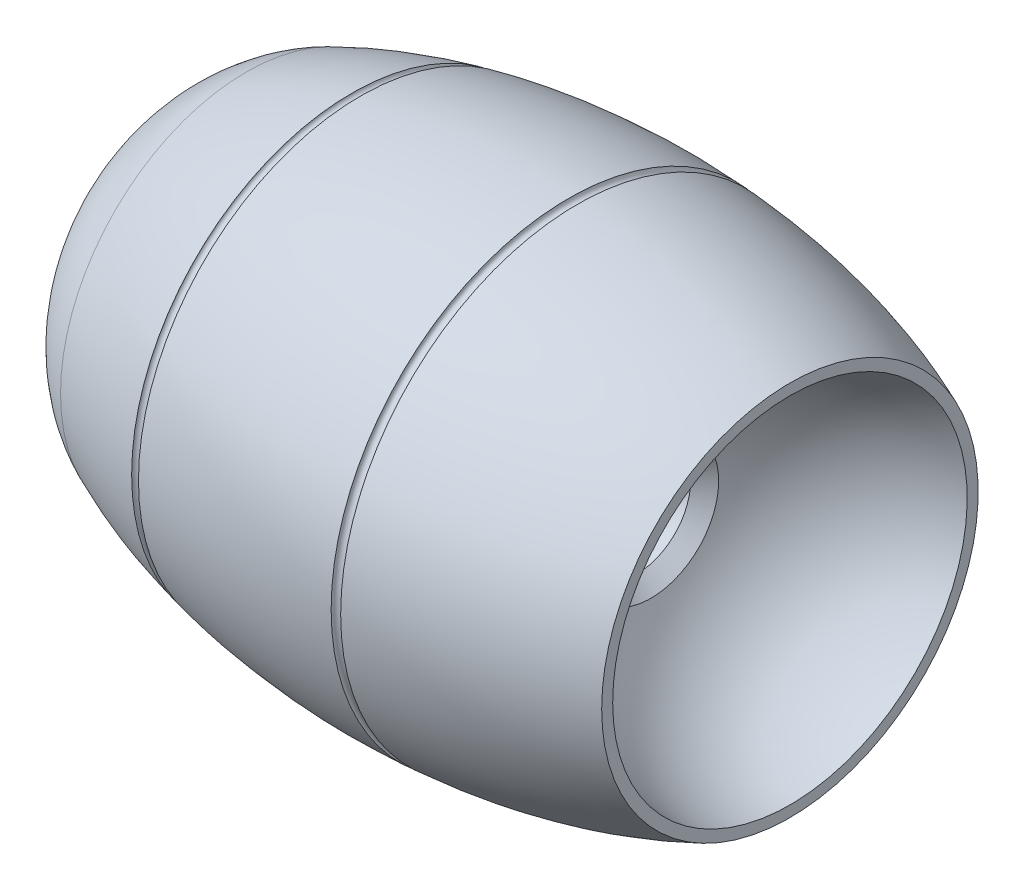
ISO-10303-21;
HEADER;
FILE_DESCRIPTION(('STEP AP214'),'2;1');
FILE_NAME('part.step','',(''),(''),'','','');
FILE_SCHEMA(('AUTOMOTIVE_DESIGN { 1 0 10303 214 1 1 1 1 }'));
ENDSEC;
DATA;
#1=APPLICATION_CONTEXT('core data for automotive mechanical design processes');
#2=APPLICATION_PROTOCOL_DEFINITION('international standard','automotive_design',2000,#1);
#3=PRODUCT_CONTEXT('',#1,'mechanical');
#4=PRODUCT('Part','Part','',(#3));
#5=PRODUCT_RELATED_PRODUCT_CATEGORY('part','',(#4));
#6=PRODUCT_DEFINITION_FORMATION('','',#4);
#7=PRODUCT_DEFINITION_CONTEXT('part definition',#1,'design');
#8=PRODUCT_DEFINITION('design','',#6,#7);
#9=PRODUCT_DEFINITION_SHAPE('','',#8);
#10=(LENGTH_UNIT() NAMED_UNIT(*) SI_UNIT(.MILLI.,.METRE.));
#11=(NAMED_UNIT(*) PLANE_ANGLE_UNIT() SI_UNIT($,.RADIAN.));
#12=(NAMED_UNIT(*) SI_UNIT($,.STERADIAN.) SOLID_ANGLE_UNIT());
#13=UNCERTAINTY_MEASURE_WITH_UNIT(LENGTH_MEASURE(1.E-05),#10,'distance_accuracy_value','');
#14=(GEOMETRIC_REPRESENTATION_CONTEXT(3) GLOBAL_UNCERTAINTY_ASSIGNED_CONTEXT((#13)) GLOBAL_UNIT_ASSIGNED_CONTEXT((#10,
#11,#12)) REPRESENTATION_CONTEXT('',''));
#15=CARTESIAN_POINT('',(0.,0.,0.));
#16=DIRECTION('',(0.,0.,1.));
#17=DIRECTION('',(1.,0.,0.));
#18=AXIS2_PLACEMENT_3D('',#15,#16,#17);
#19=CARTESIAN_POINT('',(0.,0.,0.));
#20=DIRECTION('',(0.,0.,1.));
#21=DIRECTION('',(-1.,0.,0.));
#22=AXIS2_PLACEMENT_3D('',#19,#20,#21);
#23=ELLIPSE('',#22,24.3923534354673,13.3152623381413);
#24=TRIMMED_CURVE('',#23,(PARAMETER_VALUE(3.14159265358979)),
(PARAMETER_VALUE(6.28318530717959)),.T.,.PARAMETER.);
#25=CARTESIAN_POINT('',(-11.7700081508722,0.,0.));
#26=DIRECTION('',(-1.,0.,0.));
#27=AXIS1_PLACEMENT('',#25,#26);
#28=SURFACE_OF_REVOLUTION('',#24,#27);
#29=CARTESIAN_POINT('',(15.,0.,0.));
#30=DIRECTION('',(-1.,0.,0.));
#31=DIRECTION('',(0.,0.,1.));
#32=AXIS2_PLACEMENT_3D('',#29,#30,#31);
#33=CIRCLE('',#32,10.499997616947);
#34=CARTESIAN_POINT('',(15.,0.,10.499997616947));
#35=VERTEX_POINT('',#34);
#36=EDGE_CURVE('E63',#35,#35,#33,.T.);
#37=ORIENTED_EDGE('',*,*,#36,.T.);
#38=EDGE_LOOP('',(#37));
#39=FACE_BOUND('',#38,.T.);
#40=CARTESIAN_POINT('',(3.14550472570225,0.,0.));
#41=DIRECTION('',(-1.,0.,0.));
#42=DIRECTION('',(0.,0.,1.));
#43=AXIS2_PLACEMENT_3D('',#40,#41,#42);
#44=CIRCLE('',#43,13.2040866382898);
#45=CARTESIAN_POINT('',(3.14550472570225,0.,13.2040866382898));
#46=VERTEX_POINT('',#45);
#47=EDGE_CURVE('E48',#46,#46,#44,.T.);
#48=ORIENTED_EDGE('',*,*,#47,.F.);
#49=EDGE_LOOP('',(#48));
#50=FACE_BOUND('',#49,.T.);
#51=ADVANCED_FACE('F43',(#39,#50),#28,.T.);
#52=CARTESIAN_POINT('',(15.0070741860432,0.,0.));
#53=DIRECTION('',(-1.,0.,0.));
#54=DIRECTION('',(0.,0.,1.));
#55=AXIS2_PLACEMENT_3D('',#52,#53,#54);
#56=CONICAL_SURFACE('',#55,0.,1.57012259473982);
#57=ORIENTED_EDGE('',*,*,#36,.F.);
#58=EDGE_LOOP('',(#57));
#59=FACE_BOUND('',#58,.T.);
#60=CARTESIAN_POINT('',(15.0004130483374,0.,0.));
#61=DIRECTION('',(1.,0.,0.));
#62=DIRECTION('',(0.,0.,-1.));
#63=AXIS2_PLACEMENT_3D('',#60,#61,#62);
#64=CIRCLE('',#63,9.88692262407283);
#65=CARTESIAN_POINT('',(15.0004130483374,9.88692262407283,0.));
#66=VERTEX_POINT('',#65);
#67=EDGE_CURVE('E67',#66,#66,#64,.T.);
#68=ORIENTED_EDGE('',*,*,#67,.F.);
#69=EDGE_LOOP('',(#68));
#70=FACE_BOUND('',#69,.T.);
#71=ADVANCED_FACE('F97',(#59,#70),#56,.T.);
#72=CARTESIAN_POINT('',(16.5,0.,0.));
#73=DIRECTION('',(-1.,0.,0.));
#74=DIRECTION('',(0.,1.,0.));
#75=AXIS2_PLACEMENT_3D('',#72,#73,#74);
#76=SPHERICAL_SURFACE('',#75,10.);
#77=CARTESIAN_POINT('',(7.2428665095737,0.,0.));
#78=DIRECTION('',(1.,0.,0.));
#79=DIRECTION('',(0.,0.,-1.));
#80=AXIS2_PLACEMENT_3D('',#77,#78,#79);
#81=CIRCLE('',#80,3.78225852374316);
#82=CARTESIAN_POINT('',(7.2428665095737,3.78225852374316,0.));
#83=VERTEX_POINT('',#82);
#84=EDGE_CURVE('E55',#83,#83,#81,.F.);
#85=CARTESIAN_POINT('',(7.2428665095737,3.78225852374316,0.));
#86=CARTESIAN_POINT('',(7.28354059362433,3.88181065752473,0.));
#87=CARTESIAN_POINT('',(7.32582172420384,3.98070614875977,0.));
#88=CARTESIAN_POINT('',(7.41355147396425,4.17708208116004,0.));
#89=CARTESIAN_POINT('',(7.45900009314515,4.27456252232527,0.));
#90=CARTESIAN_POINT('',(7.55301821565196,4.46800658960914,0.));
#91=CARTESIAN_POINT('',(7.60158771897787,4.56397021572778,0.));
#92=CARTESIAN_POINT('',(7.70179687390649,4.75428086119846,0.));
#93=CARTESIAN_POINT('',(7.7534365255092,4.8486278805505,0.));
#94=CARTESIAN_POINT('',(7.85973228252035,5.03560709753067,0.));
#95=CARTESIAN_POINT('',(7.91438838792878,5.1282392951588,0.));
#96=CARTESIAN_POINT('',(8.02666015525602,5.31169246678403,0.));
#97=CARTESIAN_POINT('',(8.08427581717483,5.40251344078113,0.));
#98=CARTESIAN_POINT('',(8.20240673703237,5.58224964069486,0.));
#99=CARTESIAN_POINT('',(8.26292199497111,5.6711648666115,0.));
#100=CARTESIAN_POINT('',(8.38678912404093,5.84699703137557,0.));
#101=CARTESIAN_POINT('',(8.45014099517201,5.93391397022301,0.));
#102=CARTESIAN_POINT('',(8.57961541678522,6.10565910105235,0.));
#103=CARTESIAN_POINT('',(8.64573796726734,6.19048729303424,0.));
#104=CARTESIAN_POINT('',(8.78068492980187,6.35796664436656,0.));
#105=CARTESIAN_POINT('',(8.84950934185429,6.44061780371699,0.));
#106=CARTESIAN_POINT('',(8.98978839784661,6.60365706974999,0.));
#107=CARTESIAN_POINT('',(9.0612430417865,6.68404517643256,0.));
#108=CARTESIAN_POINT('',(9.2067081944071,6.84247467239886,0.));
#109=CARTESIAN_POINT('',(9.28071870308779,6.92051606168259,0.));
#110=CARTESIAN_POINT('',(9.43121855800758,7.07417090048721,0.));
#111=CARTESIAN_POINT('',(9.50770790424668,7.1497843500081,0.));
#112=CARTESIAN_POINT('',(9.66308582722397,7.29850461382662,0.));
#113=CARTESIAN_POINT('',(9.74197440396216,7.37161142812425,0.));
#114=CARTESIAN_POINT('',(9.90206868385546,7.51524233484151,0.));
#115=CARTESIAN_POINT('',(9.98327438701057,7.58576642726114,0.));
#116=CARTESIAN_POINT('',(10.1479184040827,7.72415849156159,0.));
#117=CARTESIAN_POINT('',(10.2313567179997,7.79202646344241,0.));
#118=CARTESIAN_POINT('',(10.4003791173284,7.92503565238866,0.));
#119=CARTESIAN_POINT('',(10.4859632027401,7.99017686945408,0.));
#120=CARTESIAN_POINT('',(10.6591880725578,8.11766475239055,0.));
#121=CARTESIAN_POINT('',(10.7468288569638,8.1800114182616,0.));
#122=CARTESIAN_POINT('',(10.9240759117392,8.30184531088766,0.));
#123=CARTESIAN_POINT('',(11.0136821821086,8.36133253764268,0.));
#124=CARTESIAN_POINT('',(11.1947669501809,8.47738564010525,0.));
#125=CARTESIAN_POINT('',(11.2862454478838,8.53395151581282,0.));
#126=CARTESIAN_POINT('',(11.4709794634534,8.64410304467417,0.));
#127=CARTESIAN_POINT('',(11.5642349813201,8.69768869782795,0.));
#128=CARTESIAN_POINT('',(11.7524259805959,8.80182401177395,0.));
#129=CARTESIAN_POINT('',(11.847361462005,8.85237367256616,0.));
#130=CARTESIAN_POINT('',(12.0388135833064,8.95038439171409,0.));
#131=CARTESIAN_POINT('',(12.1353302231986,8.99784545006981,0.));
#132=CARTESIAN_POINT('',(12.3298442107956,9.08962956878931,0.));
#133=CARTESIAN_POINT('',(12.4278415585003,9.13395262915309,0.));
#134=CARTESIAN_POINT('',(12.6252149700076,9.21941462214196,0.));
#135=CARTESIAN_POINT('',(12.7245910338102,9.26055355476705,0.));
#136=CARTESIAN_POINT('',(12.9246184508205,9.33960447679699,0.));
#137=CARTESIAN_POINT('',(13.0252698040283,9.37751646620183,0.));
#138=CARTESIAN_POINT('',(13.2277430461293,9.4500740434694,0.));
#139=CARTESIAN_POINT('',(13.3295649350225,9.48471963133213,0.));
#140=CARTESIAN_POINT('',(13.5342732756208,9.55070835163792,0.));
#141=CARTESIAN_POINT('',(13.6371597273261,9.58205148408098,0.));
#142=CARTESIAN_POINT('',(13.843890116104,9.64140265843191,0.));
#143=CARTESIAN_POINT('',(13.9477340531766,9.66941070033978,0.));
#144=CARTESIAN_POINT('',(14.1562713261062,9.72206259783714,0.));
#145=CARTESIAN_POINT('',(14.2609646619631,9.74670645342663,0.));
#146=CARTESIAN_POINT('',(14.4710918089785,9.79260412890376,0.));
#147=CARTESIAN_POINT('',(14.576525620137,9.8138579487914,0.));
#148=CARTESIAN_POINT('',(14.7880238477582,9.85295418303666,0.));
#149=CARTESIAN_POINT('',(14.894088264221,9.87079659739428,0.));
#150=CARTESIAN_POINT('',(15.0004130483374,9.88692262407283,0.));
#151=B_SPLINE_CURVE_WITH_KNOTS('',3,(#85,#86,#87,#88,#89,#90,#91,#92,#93,#94,#95,#96,#97,#98,
#99,#100,#101,#102,#103,#104,#105,#106,#107,#108,#109,#110,#111,#112,#113,#114,#115,#116,#117,
#118,#119,#120,#121,#122,#123,#124,#125,#126,#127,#128,#129,#130,#131,#132,#133,#134,#135,#136,
#137,#138,#139,#140,#141,#142,#143,#144,#145,#146,#147,#148,#149,#150),.UNSPECIFIED.,.F.,.F.,(4,
2,2,2,2,2,2,2,2,2,2,2,2,2,2,2,2,2,2,2,2,2,2,2,2,2,2,2,2,2,2,2,4),(0.,0.322608135483157,
0.645216270966314,0.96782440644947,1.29043254193263,1.61304067741578,1.93564881289894,
2.2582569483821,2.58086508386525,2.90347321934841,3.22608135483157,3.54868949031472,
3.87129762579788,4.19390576128104,4.51651389676419,4.83912203224735,5.1617301677305,
5.48433830321366,5.80694643869682,6.12955457417997,6.45216270966313,6.77477084514629,
7.09737898062944,7.4199871161126,7.74259525159575,8.06520338707891,8.38781152256207,
8.71041965804523,9.03302779352838,9.35563592901154,9.6782440644947,10.0008521999779,
10.323460335461),.UNSPECIFIED.);
#152=EDGE_CURVE('BSEAM104',#83,#66,#151,.T.);
#153=ORIENTED_EDGE('',*,*,#84,.T.);
#154=ORIENTED_EDGE('',*,*,#67,.T.);
#155=ORIENTED_EDGE('',*,*,#152,.T.);
#156=ORIENTED_EDGE('',*,*,#152,.F.);
#157=EDGE_LOOP('',(#153,#155,#154,#156));
#158=FACE_BOUND('',#157,.T.);
#159=ADVANCED_FACE('F104',(#158),#76,.F.);
#160=CARTESIAN_POINT('',(-1.92584931840522,0.,0.));
#161=DIRECTION('',(-1.,0.,0.));
#162=DIRECTION('',(0.,0.,1.));
#163=AXIS2_PLACEMENT_3D('',#160,#161,#162);
#164=CYLINDRICAL_SURFACE('',#163,3.);
#165=CARTESIAN_POINT('',(6.46060798583054,0.,0.));
#166=DIRECTION('',(1.,0.,0.));
#167=DIRECTION('',(0.,0.,-1.));
#168=AXIS2_PLACEMENT_3D('',#165,#166,#167);
#169=CIRCLE('',#168,3.);
#170=CARTESIAN_POINT('',(6.46060798583054,0.,-3.));
#171=VERTEX_POINT('',#170);
#172=EDGE_CURVE('E11',#171,#171,#169,.T.);
#173=ORIENTED_EDGE('',*,*,#172,.T.);
#174=EDGE_LOOP('',(#173));
#175=FACE_BOUND('',#174,.T.);
#176=CARTESIAN_POINT('',(-3.03939201416946,0.,0.));
#177=DIRECTION('',(-1.,0.,0.));
#178=DIRECTION('',(0.,0.,1.));
#179=AXIS2_PLACEMENT_3D('',#176,#177,#178);
#180=CIRCLE('',#179,3.);
#181=CARTESIAN_POINT('',(-3.03939201416946,0.,3.));
#182=VERTEX_POINT('',#181);
#183=EDGE_CURVE('E73',#182,#182,#180,.T.);
#184=ORIENTED_EDGE('',*,*,#183,.T.);
#185=EDGE_LOOP('',(#184));
#186=FACE_BOUND('',#185,.T.);
#187=ADVANCED_FACE('F113',(#175,#186),#164,.F.);
#188=CARTESIAN_POINT('',(-3.03939201416946,0.,0.));
#189=DIRECTION('',(1.,0.,0.));
#190=DIRECTION('',(0.,0.,-1.));
#191=AXIS2_PLACEMENT_3D('',#188,#189,#190);
#192=PLANE('',#191);
#193=ORIENTED_EDGE('',*,*,#183,.F.);
#194=EDGE_LOOP('',(#193));
#195=FACE_BOUND('',#194,.T.);
#196=ADVANCED_FACE('F121',(#195),#192,.T.);
#197=CARTESIAN_POINT('',(7.2428665095737,0.,0.));
#198=DIRECTION('',(1.,0.,0.));
#199=DIRECTION('',(0.,0.,-1.));
#200=AXIS2_PLACEMENT_3D('',#197,#198,#199);
#201=CONICAL_SURFACE('',#200,3.78225852374316,0.78539816339745);
#202=ORIENTED_EDGE('',*,*,#172,.F.);
#203=EDGE_LOOP('',(#202));
#204=FACE_BOUND('',#203,.T.);
#205=ORIENTED_EDGE('',*,*,#84,.F.);
#206=EDGE_LOOP('',(#205));
#207=FACE_BOUND('',#206,.T.);
#208=ADVANCED_FACE('F46',(#204,#207),#201,.F.);
#209=CARTESIAN_POINT('',(2.89608289126108,0.,0.));
#210=DIRECTION('',(-1.,0.,0.));
#211=DIRECTION('',(0.,-1.,0.));
#212=AXIS2_PLACEMENT_3D('',#209,#210,#211);
#213=TOROIDAL_SURFACE('',#212,13.2210792397381,0.25);
#214=CARTESIAN_POINT('',(2.64656857875247,0.,0.));
#215=DIRECTION('',(-1.,0.,0.));
#216=DIRECTION('',(0.,0.,1.));
#217=AXIS2_PLACEMENT_3D('',#214,#215,#216);
#218=CIRCLE('',#217,13.2366551138188);
#219=CARTESIAN_POINT('',(2.64656857875247,0.,13.2366551138188));
#220=VERTEX_POINT('',#219);
#221=EDGE_CURVE('E84',#220,#220,#218,.F.);
#222=ORIENTED_EDGE('',*,*,#221,.T.);
#223=EDGE_LOOP('',(#222));
#224=FACE_BOUND('',#223,.T.);
#225=ORIENTED_EDGE('',*,*,#47,.T.);
#226=EDGE_LOOP('',(#225));
#227=FACE_BOUND('',#226,.T.);
#228=ADVANCED_FACE('F126',(#224,#227),#213,.F.);
#229=CARTESIAN_POINT('',(-8.94969009677688,0.,0.));
#230=DIRECTION('',(-1.,0.,0.));
#231=DIRECTION('',(0.,0.,1.));
#232=AXIS2_PLACEMENT_3D('',#229,#230,#231);
#233=CIRCLE('',#232,12.3866319135108);
#234=CARTESIAN_POINT('',(-8.94969009677688,0.,12.3866319135108));
#235=VERTEX_POINT('',#234);
#236=EDGE_CURVE('E85',#235,#235,#233,.T.);
#237=ORIENTED_EDGE('',*,*,#236,.F.);
#238=EDGE_LOOP('',(#237));
#239=FACE_BOUND('',#238,.T.);
#240=ORIENTED_EDGE('',*,*,#221,.F.);
#241=EDGE_LOOP('',(#240));
#242=FACE_BOUND('',#241,.T.);
#243=ADVANCED_FACE('F105',(#239,#242),#28,.T.);
#244=CARTESIAN_POINT('',(-9.1939171087389,0.,0.));
#245=DIRECTION('',(-1.,0.,0.));
#246=DIRECTION('',(0.,-1.,0.));
#247=AXIS2_PLACEMENT_3D('',#244,#245,#246);
#248=TOROIDAL_SURFACE('',#247,12.3332168722952,0.25);
#249=CARTESIAN_POINT('',(-9.43778901747709,0.,0.));
#250=DIRECTION('',(-1.,0.,0.));
#251=DIRECTION('',(0.,0.,1.));
#252=AXIS2_PLACEMENT_3D('',#249,#250,#251);
#253=CIRCLE('',#252,12.2782033091637);
#254=CARTESIAN_POINT('',(-9.43778901747709,0.,12.2782033091637));
#255=VERTEX_POINT('',#254);
#256=EDGE_CURVE('E76',#255,#255,#253,.F.);
#257=ORIENTED_EDGE('',*,*,#256,.T.);
#258=EDGE_LOOP('',(#257));
#259=FACE_BOUND('',#258,.T.);
#260=ORIENTED_EDGE('',*,*,#236,.T.);
#261=EDGE_LOOP('',(#260));
#262=FACE_BOUND('',#261,.T.);
#263=ADVANCED_FACE('F58',(#259,#262),#248,.F.);
#264=CARTESIAN_POINT('',(-12.2510755881369,0.,0.));
#265=DIRECTION('',(0.,0.,1.));
#266=DIRECTION('',(0.,-1.,0.));
#267=AXIS2_PLACEMENT_3D('',#264,#265,#266);
#268=ELLIPSE('',#267,11.0167383034472,9.0328415206021);
#269=TRIMMED_CURVE('',#268,(PARAMETER_VALUE(1.5707963267949)),
(PARAMETER_VALUE(4.71238898038469)),.T.,.PARAMETER.);
#270=CARTESIAN_POINT('',(-11.7700081508722,0.,0.));
#271=DIRECTION('',(-1.,0.,0.));
#272=AXIS1_PLACEMENT('',#270,#271);
#273=SURFACE_OF_REVOLUTION('',#269,#272);
#274=CARTESIAN_POINT('',(-21.283917108739,0.,0.));
#275=VERTEX_POINT('',#274);
#276=VERTEX_LOOP('',#275);
#277=FACE_BOUND('',#276,.T.);
#278=CARTESIAN_POINT('',(-15.3200648174925,0.,0.));
#279=DIRECTION('',(-1.,0.,0.));
#280=DIRECTION('',(0.,0.,1.));
#281=AXIS2_PLACEMENT_3D('',#278,#279,#280);
#282=CIRCLE('',#281,10.3613804187441);
#283=CARTESIAN_POINT('',(-15.3200648174925,0.,10.3613804187441));
#284=VERTEX_POINT('',#283);
#285=EDGE_CURVE('E64',#284,#284,#282,.T.);
#286=ORIENTED_EDGE('',*,*,#285,.T.);
#287=EDGE_LOOP('',(#286));
#288=FACE_BOUND('',#287,.T.);
#289=ADVANCED_FACE('F57',(#277,#288),#273,.T.);
#290=ORIENTED_EDGE('',*,*,#285,.F.);
#291=EDGE_LOOP('',(#290));
#292=FACE_BOUND('',#291,.T.);
#293=ORIENTED_EDGE('',*,*,#256,.F.);
#294=EDGE_LOOP('',(#293));
#295=FACE_BOUND('',#294,.T.);
#296=ADVANCED_FACE('F56',(#292,#295),#28,.T.);
#297=CLOSED_SHELL('',(#51,#71,#159,#187,#196,#208,#228,#243,#263,#289,#296));
#298=MANIFOLD_SOLID_BREP('B2',#297);
#299=ADVANCED_BREP_SHAPE_REPRESENTATION('',(#18,#298),#14);
#300=SHAPE_DEFINITION_REPRESENTATION(#9,#299);
ENDSEC;
END-ISO-10303-21;
